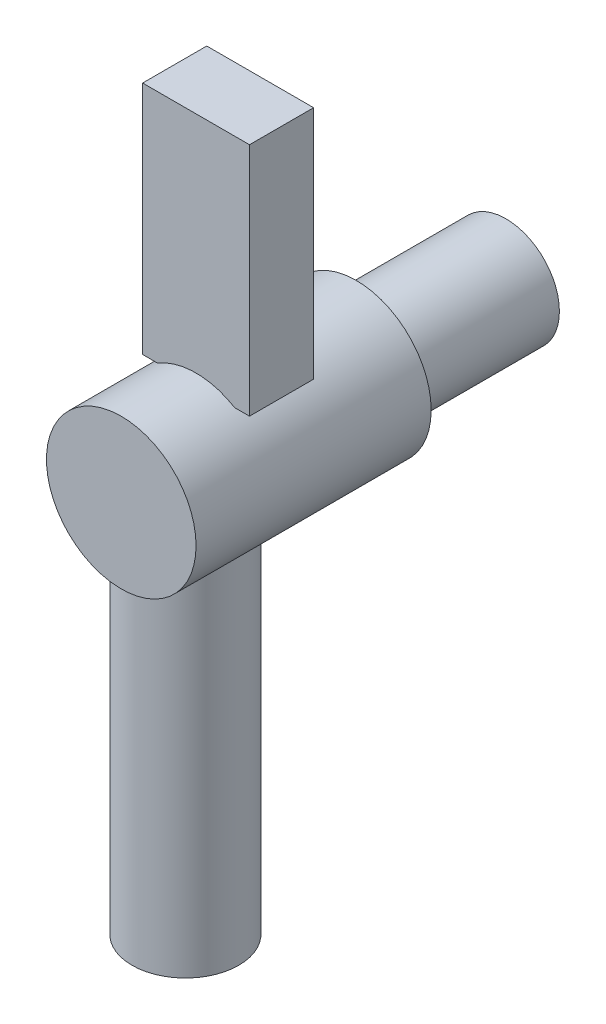
ISO-10303-21;
HEADER;
FILE_DESCRIPTION(('STEP AP214'),'2;1');
FILE_NAME('part.step','',(''),(''),'','','');
FILE_SCHEMA(('AUTOMOTIVE_DESIGN { 1 0 10303 214 1 1 1 1 }'));
ENDSEC;
DATA;
#1=APPLICATION_CONTEXT('core data for automotive mechanical design processes');
#2=APPLICATION_PROTOCOL_DEFINITION('international standard','automotive_design',2000,#1);
#3=PRODUCT_CONTEXT('',#1,'mechanical');
#4=PRODUCT('Part','Part','',(#3));
#5=PRODUCT_RELATED_PRODUCT_CATEGORY('part','',(#4));
#6=PRODUCT_DEFINITION_FORMATION('','',#4);
#7=PRODUCT_DEFINITION_CONTEXT('part definition',#1,'design');
#8=PRODUCT_DEFINITION('design','',#6,#7);
#9=PRODUCT_DEFINITION_SHAPE('','',#8);
#10=(LENGTH_UNIT() NAMED_UNIT(*) SI_UNIT(.MILLI.,.METRE.));
#11=(NAMED_UNIT(*) PLANE_ANGLE_UNIT() SI_UNIT($,.RADIAN.));
#12=(NAMED_UNIT(*) SI_UNIT($,.STERADIAN.) SOLID_ANGLE_UNIT());
#13=UNCERTAINTY_MEASURE_WITH_UNIT(LENGTH_MEASURE(1.E-05),#10,'distance_accuracy_value','');
#14=(GEOMETRIC_REPRESENTATION_CONTEXT(3) GLOBAL_UNCERTAINTY_ASSIGNED_CONTEXT((#13)) GLOBAL_UNIT_ASSIGNED_CONTEXT((#10,
#11,#12)) REPRESENTATION_CONTEXT('',''));
#15=CARTESIAN_POINT('',(0.,0.,0.));
#16=DIRECTION('',(0.,0.,1.));
#17=DIRECTION('',(1.,0.,0.));
#18=AXIS2_PLACEMENT_3D('',#15,#16,#17);
#19=CARTESIAN_POINT('',(0.,0.,36.));
#20=DIRECTION('',(0.,0.,-1.));
#21=DIRECTION('',(-1.,0.,0.));
#22=AXIS2_PLACEMENT_3D('',#19,#20,#21);
#23=CYLINDRICAL_SURFACE('',#22,7.);
#24=CARTESIAN_POINT('',(0.,-7.,25.));
#25=CARTESIAN_POINT('',(0.123706830347803,-7.00000020838972,24.9999997764531));
#26=CARTESIAN_POINT('',(0.247410973485873,-6.9967139987286,25.004597317636));
#27=CARTESIAN_POINT('',(0.493842597599124,-6.98364877001323,25.0229133669717));
#28=CARTESIAN_POINT('',(0.616569683621372,-6.97386724806996,25.0366353911351));
#29=CARTESIAN_POINT('',(0.860016934543371,-6.94804684346392,25.0729807960144));
#30=CARTESIAN_POINT('',(0.980737210968059,-6.93200830974386,25.0956036803454));
#31=CARTESIAN_POINT('',(1.21935225441358,-6.89403980063153,25.1494177779125));
#32=CARTESIAN_POINT('',(1.33724577898901,-6.87210728454189,25.1806126863906));
#33=CARTESIAN_POINT('',(1.56876671294682,-6.82296817560751,25.2509448140111));
#34=CARTESIAN_POINT('',(1.68241404829323,-6.79579130680713,25.2900373269336));
#35=CARTESIAN_POINT('',(1.90554075562293,-6.73663568699671,25.3758006679088));
#36=CARTESIAN_POINT('',(2.01501846887802,-6.70465504948954,25.422474473814));
#37=CARTESIAN_POINT('',(2.33634582627581,-6.60241573373069,25.573108234685));
#38=CARTESIAN_POINT('',(2.54129209226533,-6.52581508656121,25.6877431014888));
#39=CARTESIAN_POINT('',(2.94722710575677,-6.35349136110255,25.9530336676668));
#40=CARTESIAN_POINT('',(3.14621427453546,-6.25666965742088,26.1059971516033));
#41=CARTESIAN_POINT('',(3.51757946240277,-6.05567589289303,26.4378742840719));
#42=CARTESIAN_POINT('',(3.68991681632733,-5.95149294556457,26.6168267982152));
#43=CARTESIAN_POINT('',(3.9417150806784,-5.78580169781969,26.920325653472));
#44=CARTESIAN_POINT('',(4.03039974891772,-5.72420876579618,27.0373153776276));
#45=CARTESIAN_POINT('',(4.19756740724372,-5.60277478999017,27.2793267698587));
#46=CARTESIAN_POINT('',(4.2760476158605,-5.54293422728727,27.4043506140081));
#47=CARTESIAN_POINT('',(4.42218280560562,-5.4270606468648,27.6620110112807));
#48=CARTESIAN_POINT('',(4.48985295423516,-5.37102235890232,27.7946365368809));
#49=CARTESIAN_POINT('',(4.61381658166144,-5.2649167619883,28.0673444959287));
#50=CARTESIAN_POINT('',(4.67011181528465,-5.21484853251547,28.2074257749459));
#51=CARTESIAN_POINT('',(4.78838198824486,-5.10685206277554,28.5460728110879));
#52=CARTESIAN_POINT('',(4.84522975768853,-5.0524828289815,28.7476882861554));
#53=CARTESIAN_POINT('',(4.91148095083961,-4.98781463924069,29.0573861740696));
#54=CARTESIAN_POINT('',(4.93038988462307,-4.96907802082194,29.1617771060574));
#55=CARTESIAN_POINT('',(4.96160430011133,-4.93791198912564,29.3724633418776));
#56=CARTESIAN_POINT('',(4.97391239305786,-4.92548008185896,29.4787578754378));
#57=CARTESIAN_POINT('',(4.99174806834479,-4.9074041133857,29.6932251365514));
#58=CARTESIAN_POINT('',(4.99722896284026,-4.90180679564492,29.8014057214647));
#59=CARTESIAN_POINT('',(5.00114067376557,-4.89781588192549,30.0180268121555));
#60=CARTESIAN_POINT('',(4.9995717082929,-4.89942206309633,30.1264673097885));
#61=CARTESIAN_POINT('',(4.9894149735773,-4.9097647058501,30.3427288893992));
#62=CARTESIAN_POINT('',(4.98082357029426,-4.91850485918776,30.4505496215559));
#63=CARTESIAN_POINT('',(4.95679292982465,-4.94272114520741,30.6646984695564));
#64=CARTESIAN_POINT('',(4.94135027570228,-4.95820063893991,30.7710258132679));
#65=CARTESIAN_POINT('',(4.90151284488867,-4.99760451378595,30.9948250814693));
#66=CARTESIAN_POINT('',(4.87622911468844,-5.02235272142097,31.1119939104431));
#67=CARTESIAN_POINT('',(4.81779740683445,-5.07843189223478,31.3427667357401));
#68=CARTESIAN_POINT('',(4.78464413635863,-5.10976728413097,31.4563682743298));
#69=CARTESIAN_POINT('',(4.6740034304818,-5.21188277843352,31.7913724448214));
#70=CARTESIAN_POINT('',(4.58537486342023,-5.290730179967,32.0067587698391));
#71=CARTESIAN_POINT('',(4.41699659938633,-5.43117977056448,32.3479540095639));
#72=CARTESIAN_POINT('',(4.34470821312945,-5.48936415421452,32.4790584119764));
#73=CARTESIAN_POINT('',(4.18937966154036,-5.60880434984661,32.7333636867004));
#74=CARTESIAN_POINT('',(4.10633645234857,-5.67006102833911,32.8565623066767));
#75=CARTESIAN_POINT('',(3.9298928370481,-5.793752422172,33.0948256692271));
#76=CARTESIAN_POINT('',(3.83648396587933,-5.85618806526485,33.2098836363483));
#77=CARTESIAN_POINT('',(3.63967604580747,-5.98049354239988,33.4314288454828));
#78=CARTESIAN_POINT('',(3.53627801821644,-6.04236343357916,33.5379169616592));
#79=CARTESIAN_POINT('',(3.31865566402193,-6.16459711373884,33.7428718998703));
#80=CARTESIAN_POINT('',(3.20433257193992,-6.22493938999143,33.8412468818249));
#81=CARTESIAN_POINT('',(2.96607983417464,-6.34192222059401,34.0280612669858));
#82=CARTESIAN_POINT('',(2.84215153154959,-6.3985632904349,34.1165020550304));
#83=CARTESIAN_POINT('',(2.58534749281631,-6.50656183204897,34.282441595));
#84=CARTESIAN_POINT('',(2.45248841807631,-6.55792871427446,34.3599599306667));
#85=CARTESIAN_POINT('',(2.1782999787835,-6.65402794776657,34.5032109939681));
#86=CARTESIAN_POINT('',(2.03697382721867,-6.69876279357063,34.5689481548616));
#87=CARTESIAN_POINT('',(1.78393161589398,-6.76979900167759,34.6723873256715));
#88=CARTESIAN_POINT('',(1.67388190691354,-6.79788920127106,34.7129602050567));
#89=CARTESIAN_POINT('',(1.45016241863131,-6.84910120159546,34.7865317316341));
#90=CARTESIAN_POINT('',(1.3364934229023,-6.87222406946424,34.8195320057622));
#91=CARTESIAN_POINT('',(1.10620699746514,-6.91302945246583,34.8775404731357));
#92=CARTESIAN_POINT('',(0.989590420676744,-6.93071352231445,34.9025509503958));
#93=CARTESIAN_POINT('',(0.754198086697374,-6.96026202465164,34.9442354109564));
#94=CARTESIAN_POINT('',(0.635423324765782,-6.97212907243021,34.9609131406635));
#95=CARTESIAN_POINT('',(0.396096531940574,-6.98981803267421,34.9857429290164));
#96=CARTESIAN_POINT('',(0.275539612785602,-6.99561783247229,34.9938638021502));
#97=CARTESIAN_POINT('',(0.034058915611612,-7.00095849009119,35.0013424865321));
#98=CARTESIAN_POINT('',(-0.0868647118914833,-7.00050163923066,35.000703505825));
#99=CARTESIAN_POINT('',(-0.328194873869987,-6.99334434902713,34.9906790582753));
#100=CARTESIAN_POINT('',(-0.448601256767224,-6.98664219024223,34.9812911827097));
#101=CARTESIAN_POINT('',(-0.68792683850906,-6.96714954851426,34.9539140939111));
#102=CARTESIAN_POINT('',(-0.806846064707049,-6.95435917772169,34.9359250391197));
#103=CARTESIAN_POINT('',(-1.03669034077474,-6.92373169105251,34.8926764228558));
#104=CARTESIAN_POINT('',(-1.14772530670986,-6.90616594722286,34.8678068038953));
#105=CARTESIAN_POINT('',(-1.36703042618004,-6.86612520630985,34.8108296504221));
#106=CARTESIAN_POINT('',(-1.47529966756194,-6.84364861236167,34.7787197614764));
#107=CARTESIAN_POINT('',(-1.79502091246227,-6.76946421834351,34.6720751794697));
#108=CARTESIAN_POINT('',(-2.00155706076147,-6.71097815818561,34.5871927909131));
#109=CARTESIAN_POINT('',(-2.41580133963063,-6.57387491863986,34.3842822855905));
#110=CARTESIAN_POINT('',(-2.62191172181247,-6.49391167742686,34.2639437037929));
#111=CARTESIAN_POINT('',(-3.01190946129234,-6.32248637138391,33.9980208898307));
#112=CARTESIAN_POINT('',(-3.19577940035419,-6.23101540686786,33.8524170849791));
#113=CARTESIAN_POINT('',(-3.57103500131532,-6.0250635299762,33.5104641855287));
#114=CARTESIAN_POINT('',(-3.75775754044495,-5.9094144469246,33.3097003099485));
#115=CARTESIAN_POINT('',(-4.09660125204316,-5.67976360472222,32.8797300359142));
#116=CARTESIAN_POINT('',(-4.24870396900494,-5.56576275441127,32.6505085671316));
#117=CARTESIAN_POINT('',(-4.49468870359568,-5.36830225813508,32.2028341503059));
#118=CARTESIAN_POINT('',(-4.59394222437956,-5.28284827698324,31.9882276593417));
#119=CARTESIAN_POINT('',(-4.76250754552228,-5.13141345636178,31.5411984538393));
#120=CARTESIAN_POINT('',(-4.83188268572654,-5.06539151754964,31.3088146705693));
#121=CARTESIAN_POINT('',(-4.92694108133025,-4.97281140949568,30.8746355903277));
#122=CARTESIAN_POINT('',(-4.95835553271174,-4.94119323485648,30.6752048055897));
#123=CARTESIAN_POINT('',(-4.99670946606584,-4.90241792810042,30.2717276617993));
#124=CARTESIAN_POINT('',(-5.00367623156318,-4.89523352826001,30.0676867038902));
#125=CARTESIAN_POINT('',(-4.99264295050726,-4.90648075072078,29.6610149133286));
#126=CARTESIAN_POINT('',(-4.97464121341455,-4.92491410752053,29.4583841770913));
#127=CARTESIAN_POINT('',(-4.9149871096555,-4.98443760917989,29.0599775212603));
#128=CARTESIAN_POINT('',(-4.87329815495586,-5.02556280172843,28.8642127048289));
#129=CARTESIAN_POINT('',(-4.75069025016356,-5.14200261452279,28.4185577054958));
#130=CARTESIAN_POINT('',(-4.66126522644892,-5.22418017553764,28.1728024881646));
#131=CARTESIAN_POINT('',(-4.50210411725645,-5.36059508623752,27.8210740536322));
#132=CARTESIAN_POINT('',(-4.44479567507594,-5.40832357564202,27.7065209339307));
#133=CARTESIAN_POINT('',(-4.32220971449382,-5.50678597491543,27.4831135391533));
#134=CARTESIAN_POINT('',(-4.25693279761429,-5.55751965778047,27.3742588348022));
#135=CARTESIAN_POINT('',(-4.04590690194064,-5.71505652733019,27.0507407871444));
#136=CARTESIAN_POINT('',(-3.88776756391515,-5.82467625637418,26.8452887413705));
#137=CARTESIAN_POINT('',(-3.62795510967381,-5.98735914065857,26.5569361884445));
#138=CARTESIAN_POINT('',(-3.53753675683207,-6.04132015327539,26.4640846501339));
#139=CARTESIAN_POINT('',(-3.34923083939284,-6.14770901514368,26.285230411569));
#140=CARTESIAN_POINT('',(-3.25134194311759,-6.20013658873389,26.1992289379978));
#141=CARTESIAN_POINT('',(-3.03086404240045,-6.31122907951895,26.0203859172126));
#142=CARTESIAN_POINT('',(-2.90692152521497,-6.36941716980574,25.9289095087001));
#143=CARTESIAN_POINT('',(-2.64956836988845,-6.48069645050251,25.756920655574));
#144=CARTESIAN_POINT('',(-2.5161620512439,-6.53378994050181,25.6764032573738));
#145=CARTESIAN_POINT('',(-2.24060912964321,-6.63333305417821,25.5273971108193));
#146=CARTESIAN_POINT('',(-2.09847151388447,-6.67978935099168,25.4588962648185));
#147=CARTESIAN_POINT('',(-1.80631427486926,-6.76463878724721,25.3349835989577));
#148=CARTESIAN_POINT('',(-1.65629773671336,-6.80303505370808,25.2795667019239));
#149=CARTESIAN_POINT('',(-1.3833108981588,-6.86305258081175,25.1935234418265));
#150=CARTESIAN_POINT('',(-1.26160961479057,-6.88650604727471,25.1601258394357));
#151=CARTESIAN_POINT('',(-1.01504263181041,-6.92714135495755,25.1024795114653));
#152=CARTESIAN_POINT('',(-0.89017763434986,-6.94432457497392,25.0782287744954));
#153=CARTESIAN_POINT('',(-0.638329109483772,-6.97198481931338,25.039278263219));
#154=CARTESIAN_POINT('',(-0.511347293416882,-6.98246701467067,25.0245711241944));
#155=CARTESIAN_POINT('',(-0.256242689441558,-6.99647449097442,25.0049321169558));
#156=CARTESIAN_POINT('',(-0.128119903543471,-6.99999978417626,25.0000002315216));
#157=CARTESIAN_POINT('',(0.,-7.,25.));
#158=B_SPLINE_CURVE_WITH_KNOTS('',3,(#24,#25,#26,#27,#28,#29,#30,#31,#32,#33,#34,#35,#36,#37,
#38,#39,#40,#41,#42,#43,#44,#45,#46,#47,#48,#49,#50,#51,#52,#53,#54,#55,#56,#57,#58,#59,#60,#61,
#62,#63,#64,#65,#66,#67,#68,#69,#70,#71,#72,#73,#74,#75,#76,#77,#78,#79,#80,#81,#82,#83,#84,#85,
#86,#87,#88,#89,#90,#91,#92,#93,#94,#95,#96,#97,#98,#99,#100,#101,#102,#103,#104,#105,#106,#107,
#108,#109,#110,#111,#112,#113,#114,#115,#116,#117,#118,#119,#120,#121,#122,#123,#124,#125,#126,
#127,#128,#129,#130,#131,#132,#133,#134,#135,#136,#137,#138,#139,#140,#141,#142,#143,#144,#145,
#146,#147,#148,#149,#150,#151,#152,#153,#154,#155,#156,#157),.UNSPECIFIED.,.T.,.F.,(4,2,2,2,2,2,
2,2,2,2,2,2,2,2,2,2,2,2,2,2,2,2,2,2,2,2,2,2,2,2,2,2,2,2,2,2,2,2,2,2,2,2,2,2,2,2,2,2,2,2,2,2,2,2,
2,2,2,2,2,2,2,2,2,2,2,2,4),(0.,0.370988075311342,0.742119189353148,1.11322960901297,
1.48450025920444,1.85372534219339,2.22309580520344,2.96119440682995,3.76545645669382,
4.57093387736644,5.04808282383801,5.52536155725331,6.00196462889924,6.47849411798937,
7.12486898649107,7.44773292534191,7.77046904731893,8.09540029733771,8.4203214952134,
8.74541094303565,9.07066270584136,9.4372931744998,9.80417093025882,10.5385885670457,
11.0199765172867,11.501501010235,11.9834216722646,12.4652931137676,12.9520296640933,
13.4386982783501,13.9244828884573,14.4100843121038,14.7715471013432,15.1329321592676,
15.4942138166987,15.8553328952545,16.2177635696493,16.5800615177667,16.9424592422916,
17.304850291374,17.6498662512386,17.9949945676154,18.6847309611871,19.4371210061711,
20.190096543024,21.0793568967469,21.9690902023821,22.7207890020039,23.4708863194346,
24.0812720855668,24.6909764464859,25.3007220906012,25.9114121377249,26.7290171085949,
27.1388076467791,27.5485672699122,28.3895670350435,28.810455633468,29.2314194343295,
29.724740195124,30.2178372239682,30.7104349429706,31.2028411960804,31.587446153124,
31.9719664863837,32.356189734384,32.7404123055309),.UNSPECIFIED.);
#159=CARTESIAN_POINT('',(0.,-7.,25.));
#160=VERTEX_POINT('',#159);
#161=EDGE_CURVE('E151',#160,#160,#158,.T.);
#162=ORIENTED_EDGE('',*,*,#161,.F.);
#163=EDGE_LOOP('',(#162));
#164=FACE_BOUND('',#163,.T.);
#165=CARTESIAN_POINT('',(0.,0.,14.));
#166=DIRECTION('',(0.,0.,1.));
#167=DIRECTION('',(1.,0.,0.));
#168=AXIS2_PLACEMENT_3D('',#165,#166,#167);
#169=CIRCLE('',#168,7.);
#170=CARTESIAN_POINT('',(7.,0.,14.));
#171=VERTEX_POINT('',#170);
#172=EDGE_CURVE('E132',#171,#171,#169,.T.);
#173=ORIENTED_EDGE('',*,*,#172,.T.);
#174=EDGE_LOOP('',(#173));
#175=FACE_BOUND('',#174,.T.);
#176=CARTESIAN_POINT('',(0.,0.,36.));
#177=DIRECTION('',(0.,0.,1.));
#178=DIRECTION('',(1.,0.,0.));
#179=AXIS2_PLACEMENT_3D('',#176,#177,#178);
#180=CIRCLE('',#179,7.);
#181=CARTESIAN_POINT('',(7.,0.,36.));
#182=VERTEX_POINT('',#181);
#183=EDGE_CURVE('E136',#182,#182,#180,.T.);
#184=ORIENTED_EDGE('',*,*,#183,.F.);
#185=EDGE_LOOP('',(#184));
#186=FACE_BOUND('',#185,.T.);
#187=DIRECTION('',(0.,0.,-1.));
#188=VECTOR('',#187,1.);
#189=CARTESIAN_POINT('',(3.60555127546399,6.,36.));
#190=LINE('',#189,#188);
#191=CARTESIAN_POINT('',(3.60555127546399,6.,29.));
#192=VERTEX_POINT('',#191);
#193=CARTESIAN_POINT('',(3.60555127546399,6.,23.));
#194=VERTEX_POINT('',#193);
#195=EDGE_CURVE('E11',#192,#194,#190,.T.);
#196=ORIENTED_EDGE('',*,*,#195,.F.);
#197=CARTESIAN_POINT('',(0.,0.,29.));
#198=DIRECTION('',(0.,0.,-1.));
#199=DIRECTION('',(-1.,0.,0.));
#200=AXIS2_PLACEMENT_3D('',#197,#198,#199);
#201=CIRCLE('',#200,7.);
#202=CARTESIAN_POINT('',(-3.60555127546399,6.,29.));
#203=VERTEX_POINT('',#202);
#204=EDGE_CURVE('E59',#203,#192,#201,.T.);
#205=ORIENTED_EDGE('',*,*,#204,.F.);
#206=DIRECTION('',(0.,0.,-1.));
#207=VECTOR('',#206,1.);
#208=CARTESIAN_POINT('',(-3.60555127546399,6.,36.));
#209=LINE('',#208,#207);
#210=CARTESIAN_POINT('',(-3.60555127546399,6.,23.));
#211=VERTEX_POINT('',#210);
#212=EDGE_CURVE('E162',#211,#203,#209,.F.);
#213=ORIENTED_EDGE('',*,*,#212,.F.);
#214=CARTESIAN_POINT('',(0.,0.,23.));
#215=DIRECTION('',(0.,0.,1.));
#216=DIRECTION('',(1.,0.,0.));
#217=AXIS2_PLACEMENT_3D('',#214,#215,#216);
#218=CIRCLE('',#217,7.);
#219=EDGE_CURVE('E69',#194,#211,#218,.T.);
#220=ORIENTED_EDGE('',*,*,#219,.F.);
#221=EDGE_LOOP('',(#196,#205,#213,#220));
#222=FACE_BOUND('',#221,.T.);
#223=ADVANCED_FACE('F47',(#164,#175,#186,#222),#23,.T.);
#224=CARTESIAN_POINT('',(0.,0.,14.));
#225=DIRECTION('',(0.,0.,-1.));
#226=DIRECTION('',(-1.,0.,0.));
#227=AXIS2_PLACEMENT_3D('',#224,#225,#226);
#228=CYLINDRICAL_SURFACE('',#227,5.);
#229=CARTESIAN_POINT('',(0.,0.,14.));
#230=DIRECTION('',(0.,0.,1.));
#231=DIRECTION('',(1.,0.,0.));
#232=AXIS2_PLACEMENT_3D('',#229,#230,#231);
#233=CIRCLE('',#232,5.);
#234=CARTESIAN_POINT('',(5.,0.,14.));
#235=VERTEX_POINT('',#234);
#236=EDGE_CURVE('E150',#235,#235,#233,.T.);
#237=ORIENTED_EDGE('',*,*,#236,.F.);
#238=EDGE_LOOP('',(#237));
#239=FACE_BOUND('',#238,.T.);
#240=CARTESIAN_POINT('',(0.,0.,0.));
#241=DIRECTION('',(0.,0.,1.));
#242=DIRECTION('',(1.,0.,0.));
#243=AXIS2_PLACEMENT_3D('',#240,#241,#242);
#244=CIRCLE('',#243,5.);
#245=CARTESIAN_POINT('',(5.,0.,0.));
#246=VERTEX_POINT('',#245);
#247=EDGE_CURVE('E141',#246,#246,#244,.T.);
#248=ORIENTED_EDGE('',*,*,#247,.T.);
#249=EDGE_LOOP('',(#248));
#250=FACE_BOUND('',#249,.T.);
#251=ADVANCED_FACE('F51',(#239,#250),#228,.T.);
#252=CARTESIAN_POINT('',(0.,0.,0.));
#253=DIRECTION('',(0.,0.,1.));
#254=DIRECTION('',(1.,0.,0.));
#255=AXIS2_PLACEMENT_3D('',#252,#253,#254);
#256=PLANE('',#255);
#257=ORIENTED_EDGE('',*,*,#247,.F.);
#258=EDGE_LOOP('',(#257));
#259=FACE_BOUND('',#258,.T.);
#260=ADVANCED_FACE('F179',(#259),#256,.F.);
#261=CARTESIAN_POINT('',(0.,0.,36.));
#262=DIRECTION('',(0.,0.,1.));
#263=DIRECTION('',(1.,0.,0.));
#264=AXIS2_PLACEMENT_3D('',#261,#262,#263);
#265=PLANE('',#264);
#266=ORIENTED_EDGE('',*,*,#183,.T.);
#267=EDGE_LOOP('',(#266));
#268=FACE_BOUND('',#267,.T.);
#269=ADVANCED_FACE('F177',(#268),#265,.T.);
#270=CARTESIAN_POINT('',(0.,0.,14.));
#271=DIRECTION('',(0.,0.,1.));
#272=DIRECTION('',(1.,0.,0.));
#273=AXIS2_PLACEMENT_3D('',#270,#271,#272);
#274=PLANE('',#273);
#275=ORIENTED_EDGE('',*,*,#236,.T.);
#276=EDGE_LOOP('',(#275));
#277=FACE_BOUND('',#276,.T.);
#278=ORIENTED_EDGE('',*,*,#172,.F.);
#279=EDGE_LOOP('',(#278));
#280=FACE_BOUND('',#279,.T.);
#281=ADVANCED_FACE('F172',(#277,#280),#274,.F.);
#282=CARTESIAN_POINT('',(0.,0.,30.));
#283=DIRECTION('',(0.,-1.,0.));
#284=DIRECTION('',(0.,0.,-1.));
#285=AXIS2_PLACEMENT_3D('',#282,#283,#284);
#286=CYLINDRICAL_SURFACE('',#285,5.);
#287=CARTESIAN_POINT('',(0.,-38.,30.));
#288=DIRECTION('',(0.,1.,0.));
#289=DIRECTION('',(0.,0.,1.));
#290=AXIS2_PLACEMENT_3D('',#287,#288,#289);
#291=CIRCLE('',#290,5.);
#292=CARTESIAN_POINT('',(0.,-38.,35.));
#293=VERTEX_POINT('',#292);
#294=EDGE_CURVE('E126',#293,#293,#291,.T.);
#295=ORIENTED_EDGE('',*,*,#294,.T.);
#296=EDGE_LOOP('',(#295));
#297=FACE_BOUND('',#296,.T.);
#298=ORIENTED_EDGE('',*,*,#161,.T.);
#299=EDGE_LOOP('',(#298));
#300=FACE_BOUND('',#299,.T.);
#301=ADVANCED_FACE('F170',(#297,#300),#286,.T.);
#302=CARTESIAN_POINT('',(0.,-38.,30.));
#303=DIRECTION('',(0.,1.,0.));
#304=DIRECTION('',(0.,0.,1.));
#305=AXIS2_PLACEMENT_3D('',#302,#303,#304);
#306=PLANE('',#305);
#307=ORIENTED_EDGE('',*,*,#294,.F.);
#308=EDGE_LOOP('',(#307));
#309=FACE_BOUND('',#308,.T.);
#310=ADVANCED_FACE('F174',(#309),#306,.F.);
#311=CARTESIAN_POINT('',(0.,6.,0.));
#312=DIRECTION('',(0.,1.,0.));
#313=DIRECTION('',(0.,0.,1.));
#314=AXIS2_PLACEMENT_3D('',#311,#312,#313);
#315=PLANE('',#314);
#316=DIRECTION('',(1.,0.,0.));
#317=VECTOR('',#316,1.);
#318=CARTESIAN_POINT('',(-5.,6.,29.));
#319=LINE('',#318,#317);
#320=CARTESIAN_POINT('',(5.,6.,29.));
#321=VERTEX_POINT('',#320);
#322=EDGE_CURVE('E348',#192,#321,#319,.T.);
#323=ORIENTED_EDGE('',*,*,#322,.F.);
#324=ORIENTED_EDGE('',*,*,#195,.T.);
#325=DIRECTION('',(-1.,0.,0.));
#326=VECTOR('',#325,1.);
#327=CARTESIAN_POINT('',(5.,6.,23.));
#328=LINE('',#327,#326);
#329=CARTESIAN_POINT('',(5.,6.,23.));
#330=VERTEX_POINT('',#329);
#331=EDGE_CURVE('E125',#330,#194,#328,.T.);
#332=ORIENTED_EDGE('',*,*,#331,.F.);
#333=DIRECTION('',(0.,0.,-1.));
#334=VECTOR('',#333,1.);
#335=CARTESIAN_POINT('',(5.,6.,29.));
#336=LINE('',#335,#334);
#337=EDGE_CURVE('E339',#321,#330,#336,.T.);
#338=ORIENTED_EDGE('',*,*,#337,.F.);
#339=EDGE_LOOP('',(#323,#324,#332,#338));
#340=FACE_BOUND('',#339,.T.);
#341=ADVANCED_FACE('F232',(#340),#315,.F.);
#342=CARTESIAN_POINT('',(-5.,6.,23.));
#343=VERTEX_POINT('',#342);
#344=EDGE_CURVE('E331',#211,#343,#328,.T.);
#345=ORIENTED_EDGE('',*,*,#344,.F.);
#346=ORIENTED_EDGE('',*,*,#212,.T.);
#347=CARTESIAN_POINT('',(-5.,6.,29.));
#348=VERTEX_POINT('',#347);
#349=EDGE_CURVE('E353',#348,#203,#319,.T.);
#350=ORIENTED_EDGE('',*,*,#349,.F.);
#351=DIRECTION('',(0.,0.,1.));
#352=VECTOR('',#351,1.);
#353=CARTESIAN_POINT('',(-5.,6.,23.));
#354=LINE('',#353,#352);
#355=EDGE_CURVE('E127',#343,#348,#354,.T.);
#356=ORIENTED_EDGE('',*,*,#355,.F.);
#357=EDGE_LOOP('',(#345,#346,#350,#356));
#358=FACE_BOUND('',#357,.T.);
#359=ADVANCED_FACE('F241',(#358),#315,.F.);
#360=CARTESIAN_POINT('',(-5.,28.,23.));
#361=DIRECTION('',(1.,0.,0.));
#362=DIRECTION('',(0.,0.,-1.));
#363=AXIS2_PLACEMENT_3D('',#360,#361,#362);
#364=PLANE('',#363);
#365=ORIENTED_EDGE('',*,*,#355,.T.);
#366=DIRECTION('',(0.,-1.,0.));
#367=VECTOR('',#366,1.);
#368=CARTESIAN_POINT('',(-5.,28.,29.));
#369=LINE('',#368,#367);
#370=CARTESIAN_POINT('',(-5.,28.,29.));
#371=VERTEX_POINT('',#370);
#372=EDGE_CURVE('E102',#371,#348,#369,.T.);
#373=ORIENTED_EDGE('',*,*,#372,.F.);
#374=DIRECTION('',(0.,0.,1.));
#375=VECTOR('',#374,1.);
#376=CARTESIAN_POINT('',(-5.,28.,23.));
#377=LINE('',#376,#375);
#378=CARTESIAN_POINT('',(-5.,28.,23.));
#379=VERTEX_POINT('',#378);
#380=EDGE_CURVE('E115',#379,#371,#377,.T.);
#381=ORIENTED_EDGE('',*,*,#380,.F.);
#382=DIRECTION('',(0.,-1.,0.));
#383=VECTOR('',#382,1.);
#384=CARTESIAN_POINT('',(-5.,28.,23.));
#385=LINE('',#384,#383);
#386=EDGE_CURVE('E342',#379,#343,#385,.T.);
#387=ORIENTED_EDGE('',*,*,#386,.T.);
#388=EDGE_LOOP('',(#365,#373,#381,#387));
#389=FACE_BOUND('',#388,.T.);
#390=ADVANCED_FACE('F121',(#389),#364,.F.);
#391=CARTESIAN_POINT('',(-5.,28.,29.));
#392=DIRECTION('',(0.,0.,-1.));
#393=DIRECTION('',(-1.,0.,0.));
#394=AXIS2_PLACEMENT_3D('',#391,#392,#393);
#395=PLANE('',#394);
#396=ORIENTED_EDGE('',*,*,#349,.T.);
#397=ORIENTED_EDGE('',*,*,#204,.T.);
#398=ORIENTED_EDGE('',*,*,#322,.T.);
#399=DIRECTION('',(0.,-1.,0.));
#400=VECTOR('',#399,1.);
#401=CARTESIAN_POINT('',(5.,28.,29.));
#402=LINE('',#401,#400);
#403=CARTESIAN_POINT('',(5.,28.,29.));
#404=VERTEX_POINT('',#403);
#405=EDGE_CURVE('E110',#404,#321,#402,.T.);
#406=ORIENTED_EDGE('',*,*,#405,.F.);
#407=DIRECTION('',(1.,0.,0.));
#408=VECTOR('',#407,1.);
#409=CARTESIAN_POINT('',(-5.,28.,29.));
#410=LINE('',#409,#408);
#411=EDGE_CURVE('E97',#371,#404,#410,.T.);
#412=ORIENTED_EDGE('',*,*,#411,.F.);
#413=ORIENTED_EDGE('',*,*,#372,.T.);
#414=EDGE_LOOP('',(#396,#397,#398,#406,#412,#413));
#415=FACE_BOUND('',#414,.T.);
#416=ADVANCED_FACE('F105',(#415),#395,.F.);
#417=CARTESIAN_POINT('',(5.,28.,29.));
#418=DIRECTION('',(-1.,0.,0.));
#419=DIRECTION('',(0.,0.,1.));
#420=AXIS2_PLACEMENT_3D('',#417,#418,#419);
#421=PLANE('',#420);
#422=ORIENTED_EDGE('',*,*,#337,.T.);
#423=DIRECTION('',(0.,-1.,0.));
#424=VECTOR('',#423,1.);
#425=CARTESIAN_POINT('',(5.,28.,23.));
#426=LINE('',#425,#424);
#427=CARTESIAN_POINT('',(5.,28.,23.));
#428=VERTEX_POINT('',#427);
#429=EDGE_CURVE('E131',#428,#330,#426,.T.);
#430=ORIENTED_EDGE('',*,*,#429,.F.);
#431=DIRECTION('',(0.,0.,-1.));
#432=VECTOR('',#431,1.);
#433=CARTESIAN_POINT('',(5.,28.,29.));
#434=LINE('',#433,#432);
#435=EDGE_CURVE('E112',#404,#428,#434,.T.);
#436=ORIENTED_EDGE('',*,*,#435,.F.);
#437=ORIENTED_EDGE('',*,*,#405,.T.);
#438=EDGE_LOOP('',(#422,#430,#436,#437));
#439=FACE_BOUND('',#438,.T.);
#440=ADVANCED_FACE('F277',(#439),#421,.F.);
#441=CARTESIAN_POINT('',(5.,28.,23.));
#442=DIRECTION('',(0.,0.,1.));
#443=DIRECTION('',(1.,0.,0.));
#444=AXIS2_PLACEMENT_3D('',#441,#442,#443);
#445=PLANE('',#444);
#446=ORIENTED_EDGE('',*,*,#331,.T.);
#447=ORIENTED_EDGE('',*,*,#219,.T.);
#448=ORIENTED_EDGE('',*,*,#344,.T.);
#449=ORIENTED_EDGE('',*,*,#386,.F.);
#450=DIRECTION('',(-1.,0.,0.));
#451=VECTOR('',#450,1.);
#452=CARTESIAN_POINT('',(5.,28.,23.));
#453=LINE('',#452,#451);
#454=EDGE_CURVE('E119',#428,#379,#453,.T.);
#455=ORIENTED_EDGE('',*,*,#454,.F.);
#456=ORIENTED_EDGE('',*,*,#429,.T.);
#457=EDGE_LOOP('',(#446,#447,#448,#449,#455,#456));
#458=FACE_BOUND('',#457,.T.);
#459=ADVANCED_FACE('F290',(#458),#445,.F.);
#460=CARTESIAN_POINT('',(0.,28.,0.));
#461=DIRECTION('',(0.,1.,0.));
#462=DIRECTION('',(0.,0.,1.));
#463=AXIS2_PLACEMENT_3D('',#460,#461,#462);
#464=PLANE('',#463);
#465=ORIENTED_EDGE('',*,*,#380,.T.);
#466=ORIENTED_EDGE('',*,*,#411,.T.);
#467=ORIENTED_EDGE('',*,*,#435,.T.);
#468=ORIENTED_EDGE('',*,*,#454,.T.);
#469=EDGE_LOOP('',(#465,#466,#467,#468));
#470=FACE_BOUND('',#469,.T.);
#471=ADVANCED_FACE('F113',(#470),#464,.T.);
#472=CLOSED_SHELL('',(#223,#251,#260,#269,#281,#301,#310,#341,#359,#390,#416,#440,#459,#471));
#473=MANIFOLD_SOLID_BREP('B2',#472);
#474=ADVANCED_BREP_SHAPE_REPRESENTATION('',(#18,#473),#14);
#475=SHAPE_DEFINITION_REPRESENTATION(#9,#474);
ENDSEC;
END-ISO-10303-21;
